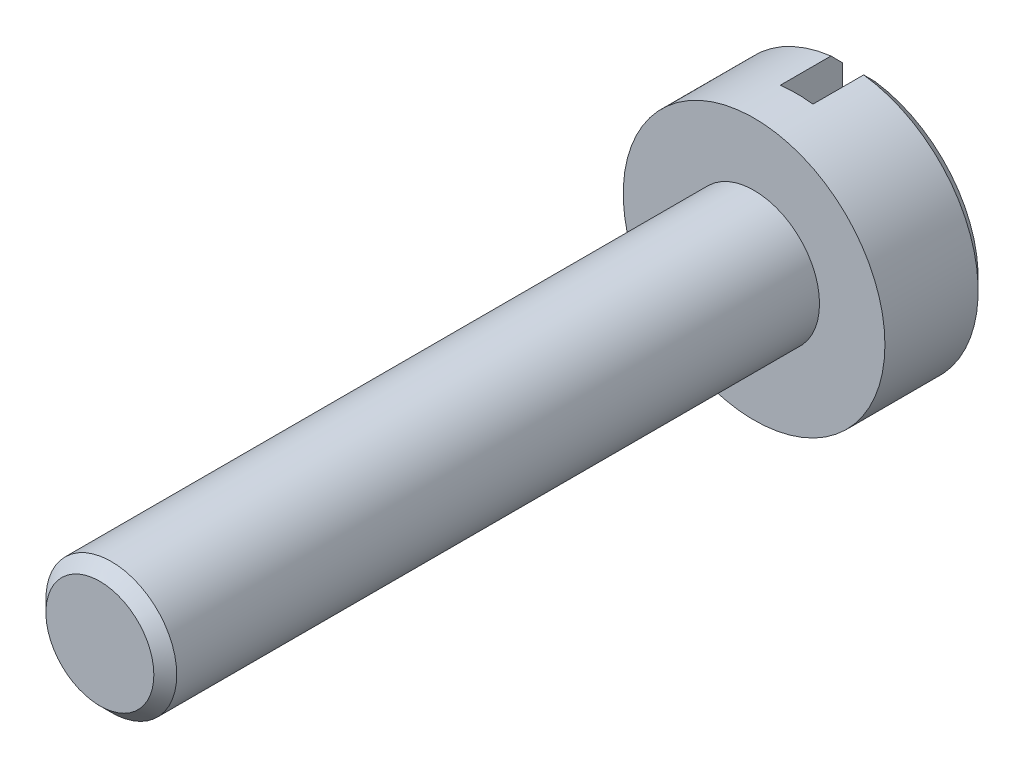
ISO-10303-21;
HEADER;
FILE_DESCRIPTION(('STEP AP214'),'2;1');
FILE_NAME('part.step','',(''),(''),'','','');
FILE_SCHEMA(('AUTOMOTIVE_DESIGN { 1 0 10303 214 1 1 1 1 }'));
ENDSEC;
DATA;
#1=APPLICATION_CONTEXT('core data for automotive mechanical design processes');
#2=APPLICATION_PROTOCOL_DEFINITION('international standard','automotive_design',2000,#1);
#3=PRODUCT_CONTEXT('',#1,'mechanical');
#4=PRODUCT('Part','Part','',(#3));
#5=PRODUCT_RELATED_PRODUCT_CATEGORY('part','',(#4));
#6=PRODUCT_DEFINITION_FORMATION('','',#4);
#7=PRODUCT_DEFINITION_CONTEXT('part definition',#1,'design');
#8=PRODUCT_DEFINITION('design','',#6,#7);
#9=PRODUCT_DEFINITION_SHAPE('','',#8);
#10=(LENGTH_UNIT() NAMED_UNIT(*) SI_UNIT(.MILLI.,.METRE.));
#11=(NAMED_UNIT(*) PLANE_ANGLE_UNIT() SI_UNIT($,.RADIAN.));
#12=(NAMED_UNIT(*) SI_UNIT($,.STERADIAN.) SOLID_ANGLE_UNIT());
#13=UNCERTAINTY_MEASURE_WITH_UNIT(LENGTH_MEASURE(1.E-05),#10,'distance_accuracy_value','');
#14=(GEOMETRIC_REPRESENTATION_CONTEXT(3) GLOBAL_UNCERTAINTY_ASSIGNED_CONTEXT((#13)) GLOBAL_UNIT_ASSIGNED_CONTEXT((#10,
#11,#12)) REPRESENTATION_CONTEXT('',''));
#15=CARTESIAN_POINT('',(0.,0.,0.));
#16=DIRECTION('',(0.,0.,1.));
#17=DIRECTION('',(1.,0.,0.));
#18=AXIS2_PLACEMENT_3D('',#15,#16,#17);
#19=CARTESIAN_POINT('',(0.,0.,0.));
#20=DIRECTION('',(0.,0.,1.));
#21=DIRECTION('',(1.,0.,0.));
#22=AXIS2_PLACEMENT_3D('',#19,#20,#21);
#23=PLANE('',#22);
#24=DIRECTION('',(0.,-1.,0.));
#25=VECTOR('',#24,1.);
#26=CARTESIAN_POINT('',(-0.499999999999994,0.,0.));
#27=LINE('',#26,#25);
#28=CARTESIAN_POINT('',(-0.499999999999994,3.61559123795818,0.));
#29=VERTEX_POINT('',#28);
#30=CARTESIAN_POINT('',(-0.499999999999994,-3.61559123795818,0.));
#31=VERTEX_POINT('',#30);
#32=EDGE_CURVE('E120',#29,#31,#27,.T.);
#33=ORIENTED_EDGE('',*,*,#32,.T.);
#34=CARTESIAN_POINT('',(0.,0.,0.));
#35=DIRECTION('',(0.,0.,1.));
#36=DIRECTION('',(1.,0.,0.));
#37=AXIS2_PLACEMENT_3D('',#34,#35,#36);
#38=CIRCLE('',#37,3.65);
#39=EDGE_CURVE('E271',#31,#29,#38,.F.);
#40=ORIENTED_EDGE('',*,*,#39,.T.);
#41=EDGE_LOOP('',(#33,#40));
#42=FACE_BOUND('',#41,.T.);
#43=ADVANCED_FACE('F28',(#42),#23,.F.);
#44=CARTESIAN_POINT('',(0.,0.,3.2));
#45=DIRECTION('',(0.,0.,1.));
#46=DIRECTION('',(1.,0.,0.));
#47=AXIS2_PLACEMENT_3D('',#44,#45,#46);
#48=PLANE('',#47);
#49=CARTESIAN_POINT('',(0.,0.,3.2));
#50=DIRECTION('',(0.,0.,1.));
#51=DIRECTION('',(1.,0.,0.));
#52=AXIS2_PLACEMENT_3D('',#49,#50,#51);
#53=CIRCLE('',#52,4.);
#54=CARTESIAN_POINT('',(4.,0.,3.2));
#55=VERTEX_POINT('',#54);
#56=EDGE_CURVE('E115',#55,#55,#53,.T.);
#57=ORIENTED_EDGE('',*,*,#56,.T.);
#58=EDGE_LOOP('',(#57));
#59=FACE_BOUND('',#58,.T.);
#60=CARTESIAN_POINT('',(0.,0.0860164604226665,3.2));
#61=DIRECTION('',(0.,0.,1.));
#62=DIRECTION('',(1.,0.,0.));
#63=AXIS2_PLACEMENT_3D('',#60,#61,#62);
#64=CIRCLE('',#63,2.);
#65=CARTESIAN_POINT('',(2.,0.0860164604226665,3.2));
#66=VERTEX_POINT('',#65);
#67=EDGE_CURVE('E112',#66,#66,#64,.T.);
#68=ORIENTED_EDGE('',*,*,#67,.F.);
#69=EDGE_LOOP('',(#68));
#70=FACE_BOUND('',#69,.T.);
#71=ADVANCED_FACE('F179',(#59,#70),#48,.T.);
#72=CARTESIAN_POINT('',(0.,0.,3.2));
#73=DIRECTION('',(0.,0.,-1.));
#74=DIRECTION('',(-1.,0.,0.));
#75=AXIS2_PLACEMENT_3D('',#72,#73,#74);
#76=CYLINDRICAL_SURFACE('',#75,4.);
#77=DIRECTION('',(0.,0.,-1.));
#78=VECTOR('',#77,1.);
#79=CARTESIAN_POINT('',(-0.5,3.96862696659689,3.2));
#80=LINE('',#79,#78);
#81=CARTESIAN_POINT('',(-0.5,3.96862696659689,1.9));
#82=VERTEX_POINT('',#81);
#83=CARTESIAN_POINT('',(-0.5,3.96862696659689,0.35));
#84=VERTEX_POINT('',#83);
#85=EDGE_CURVE('E110',#82,#84,#80,.T.);
#86=ORIENTED_EDGE('',*,*,#85,.T.);
#87=CARTESIAN_POINT('',(0.,0.,0.350000000000001));
#88=DIRECTION('',(0.,0.,1.));
#89=DIRECTION('',(1.,0.,0.));
#90=AXIS2_PLACEMENT_3D('',#87,#88,#89);
#91=CIRCLE('',#90,4.);
#92=CARTESIAN_POINT('',(-0.5,-3.96862696659689,0.35));
#93=VERTEX_POINT('',#92);
#94=EDGE_CURVE('E124',#84,#93,#91,.T.);
#95=ORIENTED_EDGE('',*,*,#94,.T.);
#96=DIRECTION('',(0.,0.,-1.));
#97=VECTOR('',#96,1.);
#98=CARTESIAN_POINT('',(-0.5,-3.96862696659689,3.2));
#99=LINE('',#98,#97);
#100=CARTESIAN_POINT('',(-0.499999999999994,-3.9686269665969,1.9));
#101=VERTEX_POINT('',#100);
#102=EDGE_CURVE('E108',#93,#101,#99,.F.);
#103=ORIENTED_EDGE('',*,*,#102,.T.);
#104=CARTESIAN_POINT('',(0.,0.,1.9));
#105=DIRECTION('',(0.,0.,1.));
#106=DIRECTION('',(1.,0.,0.));
#107=AXIS2_PLACEMENT_3D('',#104,#105,#106);
#108=CIRCLE('',#107,4.);
#109=CARTESIAN_POINT('',(0.500000000000007,-3.9686269665969,1.9));
#110=VERTEX_POINT('',#109);
#111=EDGE_CURVE('E101',#101,#110,#108,.T.);
#112=ORIENTED_EDGE('',*,*,#111,.T.);
#113=DIRECTION('',(0.,0.,-1.));
#114=VECTOR('',#113,1.);
#115=CARTESIAN_POINT('',(0.500000000000007,-3.9686269665969,3.2));
#116=LINE('',#115,#114);
#117=CARTESIAN_POINT('',(0.500000000000007,-3.9686269665969,0.350000000000001));
#118=VERTEX_POINT('',#117);
#119=EDGE_CURVE('E90',#110,#118,#116,.T.);
#120=ORIENTED_EDGE('',*,*,#119,.T.);
#121=CARTESIAN_POINT('',(0.,0.,0.350000000000001));
#122=DIRECTION('',(0.,0.,1.));
#123=DIRECTION('',(1.,0.,0.));
#124=AXIS2_PLACEMENT_3D('',#121,#122,#123);
#125=CIRCLE('',#124,4.);
#126=CARTESIAN_POINT('',(0.500000000000007,3.96862696659686,0.350000000000001));
#127=VERTEX_POINT('',#126);
#128=EDGE_CURVE('E88',#118,#127,#125,.T.);
#129=ORIENTED_EDGE('',*,*,#128,.T.);
#130=DIRECTION('',(0.,0.,-1.));
#131=VECTOR('',#130,1.);
#132=CARTESIAN_POINT('',(0.500000000000007,3.96862696659686,3.2));
#133=LINE('',#132,#131);
#134=CARTESIAN_POINT('',(0.500000000000007,3.96862696659686,1.9));
#135=VERTEX_POINT('',#134);
#136=EDGE_CURVE('E81',#127,#135,#133,.F.);
#137=ORIENTED_EDGE('',*,*,#136,.T.);
#138=EDGE_CURVE('E85',#135,#82,#108,.T.);
#139=ORIENTED_EDGE('',*,*,#138,.T.);
#140=EDGE_LOOP('',(#86,#95,#103,#112,#120,#129,#137,#139));
#141=FACE_BOUND('',#140,.T.);
#142=ORIENTED_EDGE('',*,*,#56,.F.);
#143=EDGE_LOOP('',(#142));
#144=FACE_BOUND('',#143,.T.);
#145=ADVANCED_FACE('F30',(#141,#144),#76,.T.);
#146=DIRECTION('',(0.,1.,0.));
#147=VECTOR('',#146,1.);
#148=CARTESIAN_POINT('',(0.5,0.,0.));
#149=LINE('',#148,#147);
#150=CARTESIAN_POINT('',(0.5,-3.61559123795818,0.));
#151=VERTEX_POINT('',#150);
#152=CARTESIAN_POINT('',(0.5,3.61559123795818,0.));
#153=VERTEX_POINT('',#152);
#154=EDGE_CURVE('E118',#151,#153,#149,.T.);
#155=ORIENTED_EDGE('',*,*,#154,.T.);
#156=CARTESIAN_POINT('',(0.,0.,0.));
#157=DIRECTION('',(0.,0.,1.));
#158=DIRECTION('',(1.,0.,0.));
#159=AXIS2_PLACEMENT_3D('',#156,#157,#158);
#160=CIRCLE('',#159,3.65);
#161=EDGE_CURVE('E49',#153,#151,#160,.F.);
#162=ORIENTED_EDGE('',*,*,#161,.T.);
#163=EDGE_LOOP('',(#155,#162));
#164=FACE_BOUND('',#163,.T.);
#165=ADVANCED_FACE('F182',(#164),#23,.F.);
#166=CARTESIAN_POINT('',(0.,0.0860164604226665,23.2));
#167=DIRECTION('',(0.,0.,-1.));
#168=DIRECTION('',(-1.,0.,0.));
#169=AXIS2_PLACEMENT_3D('',#166,#167,#168);
#170=CYLINDRICAL_SURFACE('',#169,2.);
#171=CARTESIAN_POINT('',(0.,0.0860164604226665,22.85));
#172=DIRECTION('',(0.,0.,1.));
#173=DIRECTION('',(1.,0.,0.));
#174=AXIS2_PLACEMENT_3D('',#171,#172,#173);
#175=CIRCLE('',#174,2.);
#176=CARTESIAN_POINT('',(2.,0.0860164604226665,22.85));
#177=VERTEX_POINT('',#176);
#178=EDGE_CURVE('E11',#177,#177,#175,.F.);
#179=ORIENTED_EDGE('',*,*,#178,.T.);
#180=EDGE_LOOP('',(#179));
#181=FACE_BOUND('',#180,.T.);
#182=ORIENTED_EDGE('',*,*,#67,.T.);
#183=EDGE_LOOP('',(#182));
#184=FACE_BOUND('',#183,.T.);
#185=ADVANCED_FACE('F188',(#181,#184),#170,.T.);
#186=CARTESIAN_POINT('',(0.,0.0860164604226665,23.2));
#187=DIRECTION('',(0.,0.,1.));
#188=DIRECTION('',(1.,0.,0.));
#189=AXIS2_PLACEMENT_3D('',#186,#187,#188);
#190=PLANE('',#189);
#191=CARTESIAN_POINT('',(0.,0.0860164604226665,23.2));
#192=DIRECTION('',(0.,0.,1.));
#193=DIRECTION('',(1.,0.,0.));
#194=AXIS2_PLACEMENT_3D('',#191,#192,#193);
#195=CIRCLE('',#194,1.65);
#196=CARTESIAN_POINT('',(1.65,0.0860164604226665,23.2));
#197=VERTEX_POINT('',#196);
#198=EDGE_CURVE('E36',#197,#197,#195,.T.);
#199=ORIENTED_EDGE('',*,*,#198,.T.);
#200=EDGE_LOOP('',(#199));
#201=FACE_BOUND('',#200,.T.);
#202=ADVANCED_FACE('F152',(#201),#190,.T.);
#203=CARTESIAN_POINT('',(0.5,4.57034126379038,1.9));
#204=DIRECTION('',(0.,0.,1.));
#205=DIRECTION('',(1.,0.,0.));
#206=AXIS2_PLACEMENT_3D('',#203,#204,#205);
#207=PLANE('',#206);
#208=DIRECTION('',(0.,-1.,0.));
#209=VECTOR('',#208,1.);
#210=CARTESIAN_POINT('',(0.5,4.57034126379038,1.9));
#211=LINE('',#210,#209);
#212=EDGE_CURVE('E98',#135,#110,#211,.T.);
#213=ORIENTED_EDGE('',*,*,#212,.T.);
#214=ORIENTED_EDGE('',*,*,#111,.F.);
#215=DIRECTION('',(0.,1.,0.));
#216=VECTOR('',#215,1.);
#217=CARTESIAN_POINT('',(-0.5,4.20333769932041,1.9));
#218=LINE('',#217,#216);
#219=EDGE_CURVE('E91',#101,#82,#218,.T.);
#220=ORIENTED_EDGE('',*,*,#219,.T.);
#221=ORIENTED_EDGE('',*,*,#138,.F.);
#222=EDGE_LOOP('',(#213,#214,#220,#221));
#223=FACE_BOUND('',#222,.T.);
#224=ADVANCED_FACE('F96',(#223),#207,.F.);
#225=CARTESIAN_POINT('',(-0.5,4.20333769932041,1.9));
#226=DIRECTION('',(-1.,0.,0.));
#227=DIRECTION('',(0.,-1.,0.));
#228=AXIS2_PLACEMENT_3D('',#225,#226,#227);
#229=PLANE('',#228);
#230=ORIENTED_EDGE('',*,*,#102,.F.);
#231=CARTESIAN_POINT('',(-0.499999999999994,-3.9686269665969,0.350000000000001));
#232=CARTESIAN_POINT('',(-0.499999999999999,-3.9098109263781,0.291643217352015));
#233=CARTESIAN_POINT('',(-0.500000000000001,-3.85098326226894,0.23329815941432));
#234=CARTESIAN_POINT('',(-0.500000000000001,-3.73330468605612,0.116631492747568));
#235=CARTESIAN_POINT('',(-0.499999999999999,-3.67445377395237,0.0583098840185951));
#236=CARTESIAN_POINT('',(-0.499999999999994,-3.61559123795818,0.));
#237=B_SPLINE_CURVE_WITH_KNOTS('',3,(#231,#232,#233,#234,#235,#236),.UNSPECIFIED.,.F.,.F.,(4,2,
4),(0.,0.24856298729424,0.49712597549161),.UNSPECIFIED.);
#238=EDGE_CURVE('E134',#93,#31,#237,.T.);
#239=ORIENTED_EDGE('',*,*,#238,.T.);
#240=ORIENTED_EDGE('',*,*,#32,.F.);
#241=CARTESIAN_POINT('',(-0.499999999999994,3.61559123795818,0.));
#242=CARTESIAN_POINT('',(-0.499999999999997,3.67445377395237,0.0583098840185929));
#243=CARTESIAN_POINT('',(-0.499999999999999,3.73330468605612,0.116631492747565));
#244=CARTESIAN_POINT('',(-0.500000000000002,3.85098326226894,0.233298159414317));
#245=CARTESIAN_POINT('',(-0.500000000000002,3.90981092637809,0.291643217352012));
#246=CARTESIAN_POINT('',(-0.5,3.96862696659689,0.350000000000001));
#247=B_SPLINE_CURVE_WITH_KNOTS('',3,(#241,#242,#243,#244,#245,#246),.UNSPECIFIED.,.F.,.F.,(4,2,
4),(0.,0.248562988197365,0.4971259754916),.UNSPECIFIED.);
#248=EDGE_CURVE('E127',#29,#84,#247,.T.);
#249=ORIENTED_EDGE('',*,*,#248,.T.);
#250=ORIENTED_EDGE('',*,*,#85,.F.);
#251=ORIENTED_EDGE('',*,*,#219,.F.);
#252=EDGE_LOOP('',(#230,#239,#240,#249,#250,#251));
#253=FACE_BOUND('',#252,.T.);
#254=ADVANCED_FACE('F143',(#253),#229,.F.);
#255=CARTESIAN_POINT('',(0.5,4.57034126379038,1.9));
#256=DIRECTION('',(1.,0.,0.));
#257=DIRECTION('',(0.,1.,0.));
#258=AXIS2_PLACEMENT_3D('',#255,#256,#257);
#259=PLANE('',#258);
#260=ORIENTED_EDGE('',*,*,#136,.F.);
#261=CARTESIAN_POINT('',(0.500000000000007,3.96862696659686,0.350000000000001));
#262=CARTESIAN_POINT('',(0.500000000000004,3.90981092637807,0.291643217352008));
#263=CARTESIAN_POINT('',(0.500000000000002,3.85098326226893,0.23329815941431));
#264=CARTESIAN_POINT('',(0.499999999999999,3.73330468605612,0.116631492747558));
#265=CARTESIAN_POINT('',(0.499999999999999,3.67445377395237,0.0583098840185882));
#266=CARTESIAN_POINT('',(0.5,3.61559123795818,0.));
#267=B_SPLINE_CURVE_WITH_KNOTS('',3,(#261,#262,#263,#264,#265,#266),.UNSPECIFIED.,.F.,.F.,(4,2,
4),(0.,0.248562987294225,0.49712597549158),.UNSPECIFIED.);
#268=EDGE_CURVE('E43',#127,#153,#267,.T.);
#269=ORIENTED_EDGE('',*,*,#268,.T.);
#270=ORIENTED_EDGE('',*,*,#154,.F.);
#271=CARTESIAN_POINT('',(0.5,-3.61559123795818,0.));
#272=CARTESIAN_POINT('',(0.499999999999999,-3.67445377395237,0.0583098840185951));
#273=CARTESIAN_POINT('',(0.499999999999998,-3.73330468605612,0.116631492747568));
#274=CARTESIAN_POINT('',(0.500000000000001,-3.85098326226894,0.23329815941432));
#275=CARTESIAN_POINT('',(0.500000000000003,-3.9098109263781,0.291643217352014));
#276=CARTESIAN_POINT('',(0.500000000000007,-3.9686269665969,0.350000000000001));
#277=B_SPLINE_CURVE_WITH_KNOTS('',3,(#271,#272,#273,#274,#275,#276),.UNSPECIFIED.,.F.,.F.,(4,2,
4),(0.,0.24856298819737,0.49712597549161),.UNSPECIFIED.);
#278=EDGE_CURVE('E156',#151,#118,#277,.T.);
#279=ORIENTED_EDGE('',*,*,#278,.T.);
#280=ORIENTED_EDGE('',*,*,#119,.F.);
#281=ORIENTED_EDGE('',*,*,#212,.F.);
#282=EDGE_LOOP('',(#260,#269,#270,#279,#280,#281));
#283=FACE_BOUND('',#282,.T.);
#284=ADVANCED_FACE('F103',(#283),#259,.F.);
#285=CARTESIAN_POINT('',(0.,0.,0.350000000000001));
#286=DIRECTION('',(0.,0.,1.));
#287=DIRECTION('',(1.,0.,0.));
#288=AXIS2_PLACEMENT_3D('',#285,#286,#287);
#289=CONICAL_SURFACE('',#288,4.,0.78539816339745);
#290=ORIENTED_EDGE('',*,*,#248,.F.);
#291=ORIENTED_EDGE('',*,*,#39,.F.);
#292=ORIENTED_EDGE('',*,*,#238,.F.);
#293=ORIENTED_EDGE('',*,*,#94,.F.);
#294=EDGE_LOOP('',(#290,#291,#292,#293));
#295=FACE_BOUND('',#294,.T.);
#296=ADVANCED_FACE('F139',(#295),#289,.T.);
#297=CARTESIAN_POINT('',(0.,0.,0.350000000000001));
#298=DIRECTION('',(0.,0.,1.));
#299=DIRECTION('',(1.,0.,0.));
#300=AXIS2_PLACEMENT_3D('',#297,#298,#299);
#301=CONICAL_SURFACE('',#300,4.,0.78539816339745);
#302=ORIENTED_EDGE('',*,*,#278,.F.);
#303=ORIENTED_EDGE('',*,*,#161,.F.);
#304=ORIENTED_EDGE('',*,*,#268,.F.);
#305=ORIENTED_EDGE('',*,*,#128,.F.);
#306=EDGE_LOOP('',(#302,#303,#304,#305));
#307=FACE_BOUND('',#306,.T.);
#308=ADVANCED_FACE('F165',(#307),#301,.T.);
#309=CARTESIAN_POINT('',(0.,0.0860164604226665,23.2));
#310=DIRECTION('',(0.,0.,-1.));
#311=DIRECTION('',(-1.,0.,0.));
#312=AXIS2_PLACEMENT_3D('',#309,#310,#311);
#313=CONICAL_SURFACE('',#312,1.65,0.785398163397443);
#314=ORIENTED_EDGE('',*,*,#178,.F.);
#315=EDGE_LOOP('',(#314));
#316=FACE_BOUND('',#315,.T.);
#317=ORIENTED_EDGE('',*,*,#198,.F.);
#318=EDGE_LOOP('',(#317));
#319=FACE_BOUND('',#318,.T.);
#320=ADVANCED_FACE('F169',(#316,#319),#313,.T.);
#321=CLOSED_SHELL('',(#43,#71,#145,#165,#185,#202,#224,#254,#284,#296,#308,#320));
#322=MANIFOLD_SOLID_BREP('B2',#321);
#323=ADVANCED_BREP_SHAPE_REPRESENTATION('',(#18,#322),#14);
#324=SHAPE_DEFINITION_REPRESENTATION(#9,#323);
ENDSEC;
END-ISO-10303-21;
